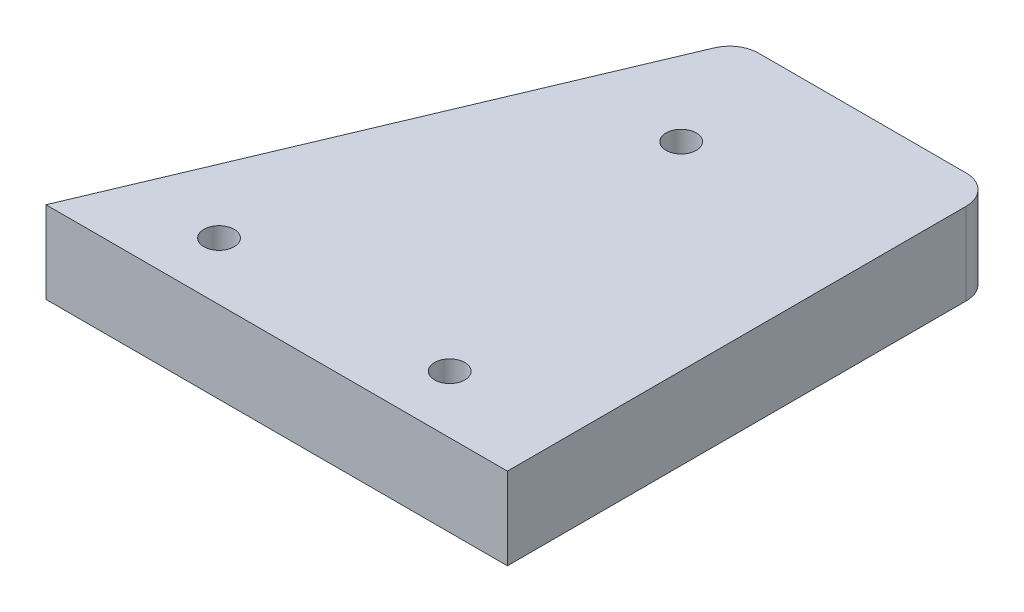
ISO-10303-21;
HEADER;
FILE_DESCRIPTION(('STEP AP214'),'2;1');
FILE_NAME('part.step','',(''),(''),'','','');
FILE_SCHEMA(('AUTOMOTIVE_DESIGN { 1 0 10303 214 1 1 1 1 }'));
ENDSEC;
DATA;
#1=APPLICATION_CONTEXT('core data for automotive mechanical design processes');
#2=APPLICATION_PROTOCOL_DEFINITION('international standard','automotive_design',2000,#1);
#3=PRODUCT_CONTEXT('',#1,'mechanical');
#4=PRODUCT('Part','Part','',(#3));
#5=PRODUCT_RELATED_PRODUCT_CATEGORY('part','',(#4));
#6=PRODUCT_DEFINITION_FORMATION('','',#4);
#7=PRODUCT_DEFINITION_CONTEXT('part definition',#1,'design');
#8=PRODUCT_DEFINITION('design','',#6,#7);
#9=PRODUCT_DEFINITION_SHAPE('','',#8);
#10=(LENGTH_UNIT() NAMED_UNIT(*) SI_UNIT(.MILLI.,.METRE.));
#11=(NAMED_UNIT(*) PLANE_ANGLE_UNIT() SI_UNIT($,.RADIAN.));
#12=(NAMED_UNIT(*) SI_UNIT($,.STERADIAN.) SOLID_ANGLE_UNIT());
#13=UNCERTAINTY_MEASURE_WITH_UNIT(LENGTH_MEASURE(1.E-05),#10,'distance_accuracy_value','');
#14=(GEOMETRIC_REPRESENTATION_CONTEXT(3) GLOBAL_UNCERTAINTY_ASSIGNED_CONTEXT((#13)) GLOBAL_UNIT_ASSIGNED_CONTEXT((#10,
#11,#12)) REPRESENTATION_CONTEXT('',''));
#15=CARTESIAN_POINT('',(0.,0.,0.));
#16=DIRECTION('',(0.,0.,1.));
#17=DIRECTION('',(1.,0.,0.));
#18=AXIS2_PLACEMENT_3D('',#15,#16,#17);
#19=CARTESIAN_POINT('',(0.,11.38,0.));
#20=DIRECTION('',(0.,1.,0.));
#21=DIRECTION('',(0.,0.,1.));
#22=AXIS2_PLACEMENT_3D('',#19,#20,#21);
#23=PLANE('',#22);
#24=CARTESIAN_POINT('',(48.,11.38,-8.));
#25=DIRECTION('',(0.,1.,0.));
#26=DIRECTION('',(0.,0.,1.));
#27=AXIS2_PLACEMENT_3D('',#24,#25,#26);
#28=CIRCLE('',#27,2.1);
#29=CARTESIAN_POINT('',(48.,11.38,-5.9));
#30=VERTEX_POINT('',#29);
#31=EDGE_CURVE('E175',#30,#30,#28,.T.);
#32=ORIENTED_EDGE('',*,*,#31,.F.);
#33=EDGE_LOOP('',(#32));
#34=FACE_BOUND('',#33,.T.);
#35=DIRECTION('',(0.,0.,-1.));
#36=VECTOR('',#35,1.);
#37=CARTESIAN_POINT('',(64.,11.38,0.));
#38=LINE('',#37,#36);
#39=CARTESIAN_POINT('',(64.,11.38,0.));
#40=VERTEX_POINT('',#39);
#41=CARTESIAN_POINT('',(64.,11.38,-63.63));
#42=VERTEX_POINT('',#41);
#43=EDGE_CURVE('E111',#40,#42,#38,.T.);
#44=ORIENTED_EDGE('',*,*,#43,.T.);
#45=CARTESIAN_POINT('',(60.,11.38,-63.63));
#46=DIRECTION('',(0.,1.,0.));
#47=DIRECTION('',(0.,0.,1.));
#48=AXIS2_PLACEMENT_3D('',#45,#46,#47);
#49=CIRCLE('',#48,4.);
#50=CARTESIAN_POINT('',(60.,11.38,-67.63));
#51=VERTEX_POINT('',#50);
#52=EDGE_CURVE('E48',#42,#51,#49,.T.);
#53=ORIENTED_EDGE('',*,*,#52,.T.);
#54=DIRECTION('',(-1.,0.,0.));
#55=VECTOR('',#54,1.);
#56=CARTESIAN_POINT('',(64.,11.38,-67.63));
#57=LINE('',#56,#55);
#58=CARTESIAN_POINT('',(31.1873519326502,11.38,-67.63));
#59=VERTEX_POINT('',#58);
#60=EDGE_CURVE('E124',#51,#59,#57,.T.);
#61=ORIENTED_EDGE('',*,*,#60,.T.);
#62=CARTESIAN_POINT('',(31.1873519326502,11.38,-63.63));
#63=DIRECTION('',(0.,1.,0.));
#64=DIRECTION('',(0.,0.,1.));
#65=AXIS2_PLACEMENT_3D('',#62,#63,#64);
#66=CIRCLE('',#65,4.);
#67=CARTESIAN_POINT('',(27.5019369393624,11.38,-65.1849007451443));
#68=VERTEX_POINT('',#67);
#69=EDGE_CURVE('E55',#59,#68,#66,.T.);
#70=ORIENTED_EDGE('',*,*,#69,.T.);
#71=DIRECTION('',(-0.388725186286065,0.,0.921353748321927));
#72=VECTOR('',#71,1.);
#73=CARTESIAN_POINT('',(28.5335403436605,11.38,-67.63));
#74=LINE('',#73,#72);
#75=CARTESIAN_POINT('',(0.,11.38,0.));
#76=VERTEX_POINT('',#75);
#77=EDGE_CURVE('E93',#68,#76,#74,.T.);
#78=ORIENTED_EDGE('',*,*,#77,.T.);
#79=DIRECTION('',(1.,0.,0.));
#80=VECTOR('',#79,1.);
#81=CARTESIAN_POINT('',(0.,11.38,0.));
#82=LINE('',#81,#80);
#83=EDGE_CURVE('E96',#76,#40,#82,.T.);
#84=ORIENTED_EDGE('',*,*,#83,.T.);
#85=EDGE_LOOP('',(#44,#53,#61,#70,#78,#84));
#86=FACE_BOUND('',#85,.T.);
#87=CARTESIAN_POINT('',(16.,11.38,-8.));
#88=DIRECTION('',(0.,1.,0.));
#89=DIRECTION('',(0.,0.,1.));
#90=AXIS2_PLACEMENT_3D('',#87,#88,#89);
#91=CIRCLE('',#90,2.1);
#92=CARTESIAN_POINT('',(16.,11.38,-5.9));
#93=VERTEX_POINT('',#92);
#94=EDGE_CURVE('E167',#93,#93,#91,.T.);
#95=ORIENTED_EDGE('',*,*,#94,.F.);
#96=EDGE_LOOP('',(#95));
#97=FACE_BOUND('',#96,.T.);
#98=CARTESIAN_POINT('',(36.4753958853243,11.38,-51.63));
#99=DIRECTION('',(0.,1.,0.));
#100=DIRECTION('',(0.,0.,1.));
#101=AXIS2_PLACEMENT_3D('',#98,#99,#100);
#102=CIRCLE('',#101,2.1);
#103=CARTESIAN_POINT('',(36.4753958853243,11.38,-49.53));
#104=VERTEX_POINT('',#103);
#105=EDGE_CURVE('E183',#104,#104,#102,.T.);
#106=ORIENTED_EDGE('',*,*,#105,.F.);
#107=EDGE_LOOP('',(#106));
#108=FACE_BOUND('',#107,.T.);
#109=ADVANCED_FACE('F39',(#34,#86,#97,#108),#23,.T.);
#110=CARTESIAN_POINT('',(0.,0.,0.));
#111=DIRECTION('',(0.,1.,0.));
#112=DIRECTION('',(0.,0.,1.));
#113=AXIS2_PLACEMENT_3D('',#110,#111,#112);
#114=PLANE('',#113);
#115=DIRECTION('',(-1.,0.,0.));
#116=VECTOR('',#115,1.);
#117=CARTESIAN_POINT('',(64.,0.,-67.63));
#118=LINE('',#117,#116);
#119=CARTESIAN_POINT('',(60.,0.,-67.63));
#120=VERTEX_POINT('',#119);
#121=CARTESIAN_POINT('',(31.1873519326502,0.,-67.63));
#122=VERTEX_POINT('',#121);
#123=EDGE_CURVE('E102',#120,#122,#118,.T.);
#124=ORIENTED_EDGE('',*,*,#123,.F.);
#125=CARTESIAN_POINT('',(60.,0.,-63.63));
#126=DIRECTION('',(0.,1.,0.));
#127=DIRECTION('',(0.,0.,1.));
#128=AXIS2_PLACEMENT_3D('',#125,#126,#127);
#129=CIRCLE('',#128,4.);
#130=CARTESIAN_POINT('',(64.,0.,-63.63));
#131=VERTEX_POINT('',#130);
#132=EDGE_CURVE('E134',#120,#131,#129,.F.);
#133=ORIENTED_EDGE('',*,*,#132,.T.);
#134=DIRECTION('',(0.,0.,-1.));
#135=VECTOR('',#134,1.);
#136=CARTESIAN_POINT('',(64.,0.,0.));
#137=LINE('',#136,#135);
#138=CARTESIAN_POINT('',(64.,0.,0.));
#139=VERTEX_POINT('',#138);
#140=EDGE_CURVE('E157',#139,#131,#137,.T.);
#141=ORIENTED_EDGE('',*,*,#140,.F.);
#142=DIRECTION('',(1.,0.,0.));
#143=VECTOR('',#142,1.);
#144=CARTESIAN_POINT('',(0.,0.,0.));
#145=LINE('',#144,#143);
#146=CARTESIAN_POINT('',(0.,0.,0.));
#147=VERTEX_POINT('',#146);
#148=EDGE_CURVE('E160',#147,#139,#145,.T.);
#149=ORIENTED_EDGE('',*,*,#148,.F.);
#150=DIRECTION('',(-0.388725186286065,0.,0.921353748321927));
#151=VECTOR('',#150,1.);
#152=CARTESIAN_POINT('',(28.5335403436605,0.,-67.63));
#153=LINE('',#152,#151);
#154=CARTESIAN_POINT('',(27.5019369393624,0.,-65.1849007451443));
#155=VERTEX_POINT('',#154);
#156=EDGE_CURVE('E115',#155,#147,#153,.T.);
#157=ORIENTED_EDGE('',*,*,#156,.F.);
#158=CARTESIAN_POINT('',(31.1873519326502,0.,-63.63));
#159=DIRECTION('',(0.,1.,0.));
#160=DIRECTION('',(0.,0.,1.));
#161=AXIS2_PLACEMENT_3D('',#158,#159,#160);
#162=CIRCLE('',#161,4.);
#163=EDGE_CURVE('E131',#155,#122,#162,.F.);
#164=ORIENTED_EDGE('',*,*,#163,.T.);
#165=EDGE_LOOP('',(#124,#133,#141,#149,#157,#164));
#166=FACE_BOUND('',#165,.T.);
#167=CARTESIAN_POINT('',(16.,0.,-8.));
#168=DIRECTION('',(0.,1.,0.));
#169=DIRECTION('',(0.,0.,1.));
#170=AXIS2_PLACEMENT_3D('',#167,#168,#169);
#171=CIRCLE('',#170,2.1);
#172=CARTESIAN_POINT('',(16.,0.,-5.9));
#173=VERTEX_POINT('',#172);
#174=EDGE_CURVE('E171',#173,#173,#171,.T.);
#175=ORIENTED_EDGE('',*,*,#174,.T.);
#176=EDGE_LOOP('',(#175));
#177=FACE_BOUND('',#176,.T.);
#178=CARTESIAN_POINT('',(48.,0.,-8.));
#179=DIRECTION('',(0.,1.,0.));
#180=DIRECTION('',(0.,0.,1.));
#181=AXIS2_PLACEMENT_3D('',#178,#179,#180);
#182=CIRCLE('',#181,2.1);
#183=CARTESIAN_POINT('',(48.,0.,-5.9));
#184=VERTEX_POINT('',#183);
#185=EDGE_CURVE('E179',#184,#184,#182,.T.);
#186=ORIENTED_EDGE('',*,*,#185,.T.);
#187=EDGE_LOOP('',(#186));
#188=FACE_BOUND('',#187,.T.);
#189=CARTESIAN_POINT('',(36.4753958853243,0.,-51.63));
#190=DIRECTION('',(0.,1.,0.));
#191=DIRECTION('',(0.,0.,1.));
#192=AXIS2_PLACEMENT_3D('',#189,#190,#191);
#193=CIRCLE('',#192,2.1);
#194=CARTESIAN_POINT('',(36.4753958853243,0.,-49.53));
#195=VERTEX_POINT('',#194);
#196=EDGE_CURVE('E187',#195,#195,#193,.T.);
#197=ORIENTED_EDGE('',*,*,#196,.T.);
#198=EDGE_LOOP('',(#197));
#199=FACE_BOUND('',#198,.T.);
#200=ADVANCED_FACE('F155',(#166,#177,#188,#199),#114,.F.);
#201=CARTESIAN_POINT('',(28.5335403436605,11.38,-67.63));
#202=DIRECTION('',(0.921353748321927,0.,0.388725186286065));
#203=DIRECTION('',(0.388725186286065,0.,-0.921353748321927));
#204=AXIS2_PLACEMENT_3D('',#201,#202,#203);
#205=PLANE('',#204);
#206=ORIENTED_EDGE('',*,*,#77,.F.);
#207=DIRECTION('',(0.,-1.,0.));
#208=VECTOR('',#207,1.);
#209=CARTESIAN_POINT('',(27.5019369393624,11.38,-65.1849007451443));
#210=LINE('',#209,#208);
#211=EDGE_CURVE('E11',#68,#155,#210,.T.);
#212=ORIENTED_EDGE('',*,*,#211,.T.);
#213=ORIENTED_EDGE('',*,*,#156,.T.);
#214=DIRECTION('',(0.,-1.,0.));
#215=VECTOR('',#214,1.);
#216=CARTESIAN_POINT('',(0.,11.38,0.));
#217=LINE('',#216,#215);
#218=EDGE_CURVE('E107',#76,#147,#217,.T.);
#219=ORIENTED_EDGE('',*,*,#218,.F.);
#220=EDGE_LOOP('',(#206,#212,#213,#219));
#221=FACE_BOUND('',#220,.T.);
#222=ADVANCED_FACE('F113',(#221),#205,.F.);
#223=CARTESIAN_POINT('',(0.,11.38,0.));
#224=DIRECTION('',(0.,0.,-1.));
#225=DIRECTION('',(-1.,0.,0.));
#226=AXIS2_PLACEMENT_3D('',#223,#224,#225);
#227=PLANE('',#226);
#228=ORIENTED_EDGE('',*,*,#148,.T.);
#229=DIRECTION('',(0.,-1.,0.));
#230=VECTOR('',#229,1.);
#231=CARTESIAN_POINT('',(64.,11.38,0.));
#232=LINE('',#231,#230);
#233=EDGE_CURVE('E109',#40,#139,#232,.T.);
#234=ORIENTED_EDGE('',*,*,#233,.F.);
#235=ORIENTED_EDGE('',*,*,#83,.F.);
#236=ORIENTED_EDGE('',*,*,#218,.T.);
#237=EDGE_LOOP('',(#228,#234,#235,#236));
#238=FACE_BOUND('',#237,.T.);
#239=ADVANCED_FACE('F106',(#238),#227,.F.);
#240=CARTESIAN_POINT('',(64.,11.38,0.));
#241=DIRECTION('',(-1.,0.,0.));
#242=DIRECTION('',(0.,0.,1.));
#243=AXIS2_PLACEMENT_3D('',#240,#241,#242);
#244=PLANE('',#243);
#245=ORIENTED_EDGE('',*,*,#140,.T.);
#246=DIRECTION('',(0.,-1.,0.));
#247=VECTOR('',#246,1.);
#248=CARTESIAN_POINT('',(64.,11.38,-63.63));
#249=LINE('',#248,#247);
#250=EDGE_CURVE('E63',#131,#42,#249,.F.);
#251=ORIENTED_EDGE('',*,*,#250,.T.);
#252=ORIENTED_EDGE('',*,*,#43,.F.);
#253=ORIENTED_EDGE('',*,*,#233,.T.);
#254=EDGE_LOOP('',(#245,#251,#252,#253));
#255=FACE_BOUND('',#254,.T.);
#256=ADVANCED_FACE('F158',(#255),#244,.F.);
#257=CARTESIAN_POINT('',(64.,11.38,-67.63));
#258=DIRECTION('',(0.,0.,1.));
#259=DIRECTION('',(1.,0.,0.));
#260=AXIS2_PLACEMENT_3D('',#257,#258,#259);
#261=PLANE('',#260);
#262=ORIENTED_EDGE('',*,*,#60,.F.);
#263=DIRECTION('',(0.,-1.,0.));
#264=VECTOR('',#263,1.);
#265=CARTESIAN_POINT('',(60.,11.38,-67.63));
#266=LINE('',#265,#264);
#267=EDGE_CURVE('E122',#51,#120,#266,.T.);
#268=ORIENTED_EDGE('',*,*,#267,.T.);
#269=ORIENTED_EDGE('',*,*,#123,.T.);
#270=DIRECTION('',(0.,-1.,0.));
#271=VECTOR('',#270,1.);
#272=CARTESIAN_POINT('',(31.1873519326502,11.38,-67.63));
#273=LINE('',#272,#271);
#274=EDGE_CURVE('E118',#122,#59,#273,.F.);
#275=ORIENTED_EDGE('',*,*,#274,.T.);
#276=EDGE_LOOP('',(#262,#268,#269,#275));
#277=FACE_BOUND('',#276,.T.);
#278=ADVANCED_FACE('F146',(#277),#261,.F.);
#279=CARTESIAN_POINT('',(16.,11.38,-8.));
#280=DIRECTION('',(0.,-1.,0.));
#281=DIRECTION('',(0.,0.,-1.));
#282=AXIS2_PLACEMENT_3D('',#279,#280,#281);
#283=CYLINDRICAL_SURFACE('',#282,2.1);
#284=ORIENTED_EDGE('',*,*,#94,.T.);
#285=EDGE_LOOP('',(#284));
#286=FACE_BOUND('',#285,.T.);
#287=ORIENTED_EDGE('',*,*,#174,.F.);
#288=EDGE_LOOP('',(#287));
#289=FACE_BOUND('',#288,.T.);
#290=ADVANCED_FACE('F207',(#286,#289),#283,.F.);
#291=CARTESIAN_POINT('',(48.,11.38,-8.));
#292=DIRECTION('',(0.,-1.,0.));
#293=DIRECTION('',(0.,0.,-1.));
#294=AXIS2_PLACEMENT_3D('',#291,#292,#293);
#295=CYLINDRICAL_SURFACE('',#294,2.1);
#296=ORIENTED_EDGE('',*,*,#31,.T.);
#297=EDGE_LOOP('',(#296));
#298=FACE_BOUND('',#297,.T.);
#299=ORIENTED_EDGE('',*,*,#185,.F.);
#300=EDGE_LOOP('',(#299));
#301=FACE_BOUND('',#300,.T.);
#302=ADVANCED_FACE('F223',(#298,#301),#295,.F.);
#303=CARTESIAN_POINT('',(36.4753958853243,11.38,-51.63));
#304=DIRECTION('',(0.,-1.,0.));
#305=DIRECTION('',(0.,0.,-1.));
#306=AXIS2_PLACEMENT_3D('',#303,#304,#305);
#307=CYLINDRICAL_SURFACE('',#306,2.1);
#308=ORIENTED_EDGE('',*,*,#105,.T.);
#309=EDGE_LOOP('',(#308));
#310=FACE_BOUND('',#309,.T.);
#311=ORIENTED_EDGE('',*,*,#196,.F.);
#312=EDGE_LOOP('',(#311));
#313=FACE_BOUND('',#312,.T.);
#314=ADVANCED_FACE('F195',(#310,#313),#307,.F.);
#315=CARTESIAN_POINT('',(60.,11.38,-63.63));
#316=DIRECTION('',(0.,-1.,0.));
#317=DIRECTION('',(0.,0.,-1.));
#318=AXIS2_PLACEMENT_3D('',#315,#316,#317);
#319=CYLINDRICAL_SURFACE('',#318,4.);
#320=ORIENTED_EDGE('',*,*,#52,.F.);
#321=ORIENTED_EDGE('',*,*,#250,.F.);
#322=ORIENTED_EDGE('',*,*,#132,.F.);
#323=ORIENTED_EDGE('',*,*,#267,.F.);
#324=EDGE_LOOP('',(#320,#321,#322,#323));
#325=FACE_BOUND('',#324,.T.);
#326=ADVANCED_FACE('F152',(#325),#319,.T.);
#327=CARTESIAN_POINT('',(31.1873519326502,11.38,-63.63));
#328=DIRECTION('',(0.,-1.,0.));
#329=DIRECTION('',(0.,0.,-1.));
#330=AXIS2_PLACEMENT_3D('',#327,#328,#329);
#331=CYLINDRICAL_SURFACE('',#330,4.);
#332=ORIENTED_EDGE('',*,*,#69,.F.);
#333=ORIENTED_EDGE('',*,*,#274,.F.);
#334=ORIENTED_EDGE('',*,*,#163,.F.);
#335=ORIENTED_EDGE('',*,*,#211,.F.);
#336=EDGE_LOOP('',(#332,#333,#334,#335));
#337=FACE_BOUND('',#336,.T.);
#338=ADVANCED_FACE('F41',(#337),#331,.T.);
#339=CLOSED_SHELL('',(#109,#200,#222,#239,#256,#278,#290,#302,#314,#326,#338));
#340=MANIFOLD_SOLID_BREP('B2',#339);
#341=ADVANCED_BREP_SHAPE_REPRESENTATION('',(#18,#340),#14);
#342=SHAPE_DEFINITION_REPRESENTATION(#9,#341);
ENDSEC;
END-ISO-10303-21;
